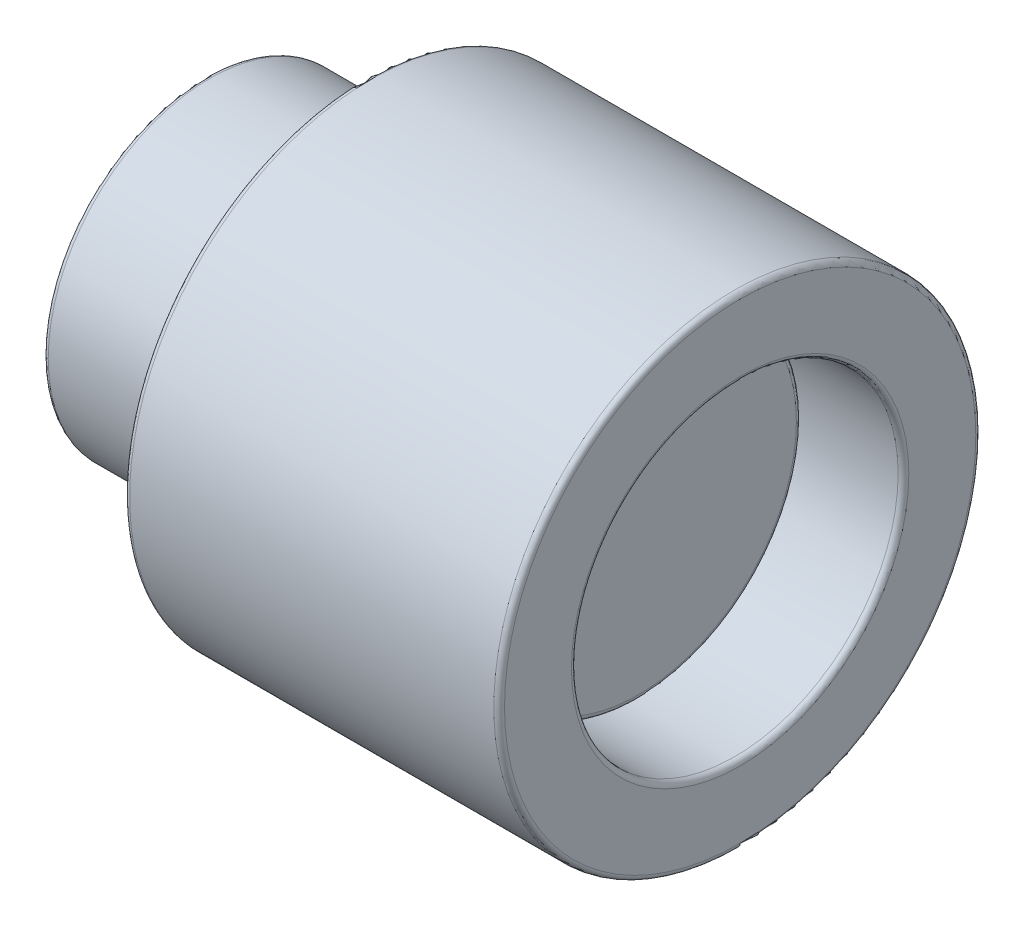
ISO-10303-21;
HEADER;
FILE_DESCRIPTION(('STEP AP214'),'2;1');
FILE_NAME('part.step','',(''),(''),'','','');
FILE_SCHEMA(('AUTOMOTIVE_DESIGN { 1 0 10303 214 1 1 1 1 }'));
ENDSEC;
DATA;
#1=APPLICATION_CONTEXT('core data for automotive mechanical design processes');
#2=APPLICATION_PROTOCOL_DEFINITION('international standard','automotive_design',2000,#1);
#3=PRODUCT_CONTEXT('',#1,'mechanical');
#4=PRODUCT('Part','Part','',(#3));
#5=PRODUCT_RELATED_PRODUCT_CATEGORY('part','',(#4));
#6=PRODUCT_DEFINITION_FORMATION('','',#4);
#7=PRODUCT_DEFINITION_CONTEXT('part definition',#1,'design');
#8=PRODUCT_DEFINITION('design','',#6,#7);
#9=PRODUCT_DEFINITION_SHAPE('','',#8);
#10=(LENGTH_UNIT() NAMED_UNIT(*) SI_UNIT(.MILLI.,.METRE.));
#11=(NAMED_UNIT(*) PLANE_ANGLE_UNIT() SI_UNIT($,.RADIAN.));
#12=(NAMED_UNIT(*) SI_UNIT($,.STERADIAN.) SOLID_ANGLE_UNIT());
#13=UNCERTAINTY_MEASURE_WITH_UNIT(LENGTH_MEASURE(1.E-05),#10,'distance_accuracy_value','');
#14=(GEOMETRIC_REPRESENTATION_CONTEXT(3) GLOBAL_UNCERTAINTY_ASSIGNED_CONTEXT((#13)) GLOBAL_UNIT_ASSIGNED_CONTEXT((#10,
#11,#12)) REPRESENTATION_CONTEXT('',''));
#15=CARTESIAN_POINT('',(0.,0.,0.));
#16=DIRECTION('',(0.,0.,1.));
#17=DIRECTION('',(1.,0.,0.));
#18=AXIS2_PLACEMENT_3D('',#15,#16,#17);
#19=CARTESIAN_POINT('',(5.1,0.,0.));
#20=DIRECTION('',(1.,0.,0.));
#21=DIRECTION('',(0.,0.,-1.));
#22=AXIS2_PLACEMENT_3D('',#19,#20,#21);
#23=PLANE('',#22);
#24=CARTESIAN_POINT('',(5.1,0.,0.));
#25=DIRECTION('',(1.,0.,0.));
#26=DIRECTION('',(0.,0.,-1.));
#27=AXIS2_PLACEMENT_3D('',#24,#25,#26);
#28=CIRCLE('',#27,2.95);
#29=CARTESIAN_POINT('',(5.1,0.,-2.95));
#30=VERTEX_POINT('',#29);
#31=EDGE_CURVE('E11',#30,#30,#28,.T.);
#32=ORIENTED_EDGE('',*,*,#31,.T.);
#33=EDGE_LOOP('',(#32));
#34=FACE_BOUND('',#33,.T.);
#35=ADVANCED_FACE('F48',(#34),#23,.T.);
#36=CARTESIAN_POINT('',(15.6267027304759,0.,0.));
#37=DIRECTION('',(-1.,0.,0.));
#38=DIRECTION('',(0.,0.,1.));
#39=AXIS2_PLACEMENT_3D('',#36,#37,#38);
#40=CYLINDRICAL_SURFACE('',#39,3.05);
#41=CARTESIAN_POINT('',(5.,0.,0.));
#42=DIRECTION('',(1.,0.,0.));
#43=DIRECTION('',(0.,0.,-1.));
#44=AXIS2_PLACEMENT_3D('',#41,#42,#43);
#45=CIRCLE('',#44,3.05);
#46=CARTESIAN_POINT('',(5.,0.,-3.05));
#47=VERTEX_POINT('',#46);
#48=EDGE_CURVE('E55',#47,#47,#45,.F.);
#49=ORIENTED_EDGE('',*,*,#48,.T.);
#50=EDGE_LOOP('',(#49));
#51=FACE_BOUND('',#50,.T.);
#52=CARTESIAN_POINT('',(0.,0.,0.));
#53=DIRECTION('',(1.,0.,0.));
#54=DIRECTION('',(0.,0.,-1.));
#55=AXIS2_PLACEMENT_3D('',#52,#53,#54);
#56=CIRCLE('',#55,3.05);
#57=CARTESIAN_POINT('',(0.,0.,-3.05));
#58=VERTEX_POINT('',#57);
#59=EDGE_CURVE('E71',#58,#58,#56,.F.);
#60=ORIENTED_EDGE('',*,*,#59,.F.);
#61=EDGE_LOOP('',(#60));
#62=FACE_BOUND('',#61,.T.);
#63=ADVANCED_FACE('F78',(#51,#62),#40,.T.);
#64=CARTESIAN_POINT('',(8.62670273047588,0.,0.));
#65=DIRECTION('',(-1.,0.,0.));
#66=DIRECTION('',(0.,0.,1.));
#67=AXIS2_PLACEMENT_3D('',#64,#65,#66);
#68=CYLINDRICAL_SURFACE('',#67,3.02);
#69=CARTESIAN_POINT('',(-0.0714142842854291,0.,0.));
#70=DIRECTION('',(1.,0.,0.));
#71=DIRECTION('',(0.,0.,-1.));
#72=AXIS2_PLACEMENT_3D('',#69,#70,#71);
#73=CIRCLE('',#72,3.02);
#74=CARTESIAN_POINT('',(-0.0714142842854291,0.,-3.02));
#75=VERTEX_POINT('',#74);
#76=EDGE_CURVE('E59',#75,#75,#73,.F.);
#77=ORIENTED_EDGE('',*,*,#76,.T.);
#78=EDGE_LOOP('',(#77));
#79=FACE_BOUND('',#78,.T.);
#80=CARTESIAN_POINT('',(-2.9,0.,0.));
#81=DIRECTION('',(-1.,0.,0.));
#82=DIRECTION('',(0.,0.,1.));
#83=AXIS2_PLACEMENT_3D('',#80,#81,#82);
#84=CIRCLE('',#83,3.02);
#85=CARTESIAN_POINT('',(-2.9,0.,3.02));
#86=VERTEX_POINT('',#85);
#87=EDGE_CURVE('E63',#86,#86,#84,.F.);
#88=ORIENTED_EDGE('',*,*,#87,.T.);
#89=EDGE_LOOP('',(#88));
#90=FACE_BOUND('',#89,.T.);
#91=ADVANCED_FACE('F80',(#79,#90),#68,.T.);
#92=CARTESIAN_POINT('',(-3.,0.,0.));
#93=DIRECTION('',(-1.,0.,0.));
#94=DIRECTION('',(0.,0.,1.));
#95=AXIS2_PLACEMENT_3D('',#92,#93,#94);
#96=PLANE('',#95);
#97=CARTESIAN_POINT('',(-3.,0.,0.));
#98=DIRECTION('',(-1.,0.,0.));
#99=DIRECTION('',(0.,0.,1.));
#100=AXIS2_PLACEMENT_3D('',#97,#98,#99);
#101=CIRCLE('',#100,2.92);
#102=CARTESIAN_POINT('',(-3.,0.,2.92));
#103=VERTEX_POINT('',#102);
#104=EDGE_CURVE('E68',#103,#103,#101,.T.);
#105=ORIENTED_EDGE('',*,*,#104,.T.);
#106=EDGE_LOOP('',(#105));
#107=FACE_BOUND('',#106,.T.);
#108=ADVANCED_FACE('F86',(#107),#96,.T.);
#109=CARTESIAN_POINT('',(-2.9,0.,0.));
#110=DIRECTION('',(-1.,0.,0.));
#111=DIRECTION('',(0.,0.,1.));
#112=AXIS2_PLACEMENT_3D('',#109,#110,#111);
#113=TOROIDAL_SURFACE('',#112,2.92,0.1);
#114=ORIENTED_EDGE('',*,*,#87,.F.);
#115=EDGE_LOOP('',(#114));
#116=FACE_BOUND('',#115,.T.);
#117=ORIENTED_EDGE('',*,*,#104,.F.);
#118=EDGE_LOOP('',(#117));
#119=FACE_BOUND('',#118,.T.);
#120=ADVANCED_FACE('F92',(#116,#119),#113,.T.);
#121=CARTESIAN_POINT('',(-0.0714142842854287,0.,0.));
#122=DIRECTION('',(1.,0.,0.));
#123=DIRECTION('',(0.,0.,-1.));
#124=AXIS2_PLACEMENT_3D('',#121,#122,#123);
#125=TOROIDAL_SURFACE('',#124,3.12,0.1);
#126=ORIENTED_EDGE('',*,*,#59,.T.);
#127=EDGE_LOOP('',(#126));
#128=FACE_BOUND('',#127,.T.);
#129=ORIENTED_EDGE('',*,*,#76,.F.);
#130=EDGE_LOOP('',(#129));
#131=FACE_BOUND('',#130,.T.);
#132=ADVANCED_FACE('F75',(#128,#131),#125,.F.);
#133=CARTESIAN_POINT('',(5.,0.,0.));
#134=DIRECTION('',(1.,0.,0.));
#135=DIRECTION('',(0.,0.,-1.));
#136=AXIS2_PLACEMENT_3D('',#133,#134,#135);
#137=TOROIDAL_SURFACE('',#136,2.95,0.1);
#138=ORIENTED_EDGE('',*,*,#31,.F.);
#139=EDGE_LOOP('',(#138));
#140=FACE_BOUND('',#139,.T.);
#141=ORIENTED_EDGE('',*,*,#48,.F.);
#142=EDGE_LOOP('',(#141));
#143=FACE_BOUND('',#142,.T.);
#144=ADVANCED_FACE('F50',(#140,#143),#137,.T.);
#145=CLOSED_SHELL('',(#35,#63,#91,#108,#120,#132,#144));
#146=MANIFOLD_SOLID_BREP('B2',#145);
#147=CARTESIAN_POINT('',(7.,0.,0.));
#148=DIRECTION('',(1.,0.,0.));
#149=DIRECTION('',(0.,0.,-1.));
#150=AXIS2_PLACEMENT_3D('',#147,#148,#149);
#151=PLANE('',#150);
#152=CARTESIAN_POINT('',(7.,0.,0.));
#153=DIRECTION('',(1.,0.,0.));
#154=DIRECTION('',(0.,0.,-1.));
#155=AXIS2_PLACEMENT_3D('',#152,#153,#154);
#156=CIRCLE('',#155,3.15);
#157=CARTESIAN_POINT('',(7.,0.,-3.15));
#158=VERTEX_POINT('',#157);
#159=EDGE_CURVE('E179',#158,#158,#156,.F.);
#160=ORIENTED_EDGE('',*,*,#159,.T.);
#161=EDGE_LOOP('',(#160));
#162=FACE_BOUND('',#161,.T.);
#163=CARTESIAN_POINT('',(7.,0.,0.));
#164=DIRECTION('',(1.,0.,0.));
#165=DIRECTION('',(0.,0.,-1.));
#166=AXIS2_PLACEMENT_3D('',#163,#164,#165);
#167=CIRCLE('',#166,4.4);
#168=CARTESIAN_POINT('',(7.,0.,-4.4));
#169=VERTEX_POINT('',#168);
#170=EDGE_CURVE('E184',#169,#169,#167,.T.);
#171=ORIENTED_EDGE('',*,*,#170,.T.);
#172=EDGE_LOOP('',(#171));
#173=FACE_BOUND('',#172,.T.);
#174=ADVANCED_FACE('F164',(#162,#173),#151,.T.);
#175=CARTESIAN_POINT('',(0.,0.,0.));
#176=DIRECTION('',(1.,0.,0.));
#177=DIRECTION('',(0.,0.,-1.));
#178=AXIS2_PLACEMENT_3D('',#175,#176,#177);
#179=PLANE('',#178);
#180=CARTESIAN_POINT('',(0.,0.,0.));
#181=DIRECTION('',(1.,0.,0.));
#182=DIRECTION('',(0.,0.,-1.));
#183=AXIS2_PLACEMENT_3D('',#180,#181,#182);
#184=CIRCLE('',#183,4.4);
#185=CARTESIAN_POINT('',(0.,0.,-4.4));
#186=VERTEX_POINT('',#185);
#187=EDGE_CURVE('E47',#186,#186,#184,.F.);
#188=ORIENTED_EDGE('',*,*,#187,.T.);
#189=EDGE_LOOP('',(#188));
#190=FACE_BOUND('',#189,.T.);
#191=CARTESIAN_POINT('',(0.,0.,0.));
#192=DIRECTION('',(1.,0.,0.));
#193=DIRECTION('',(0.,0.,-1.));
#194=AXIS2_PLACEMENT_3D('',#191,#192,#193);
#195=CIRCLE('',#194,3.05);
#196=CARTESIAN_POINT('',(0.,0.,-3.05));
#197=VERTEX_POINT('',#196);
#198=EDGE_CURVE('E190',#197,#197,#195,.T.);
#199=ORIENTED_EDGE('',*,*,#198,.T.);
#200=EDGE_LOOP('',(#199));
#201=FACE_BOUND('',#200,.T.);
#202=ADVANCED_FACE('F194',(#190,#201),#179,.F.);
#203=CARTESIAN_POINT('',(7.,0.,0.));
#204=DIRECTION('',(-1.,0.,0.));
#205=DIRECTION('',(0.,0.,1.));
#206=AXIS2_PLACEMENT_3D('',#203,#204,#205);
#207=CYLINDRICAL_SURFACE('',#206,4.5);
#208=CARTESIAN_POINT('',(0.1,0.,0.));
#209=DIRECTION('',(1.,0.,0.));
#210=DIRECTION('',(0.,0.,-1.));
#211=AXIS2_PLACEMENT_3D('',#208,#209,#210);
#212=CIRCLE('',#211,4.5);
#213=CARTESIAN_POINT('',(0.1,0.,-4.5));
#214=VERTEX_POINT('',#213);
#215=EDGE_CURVE('E171',#214,#214,#212,.T.);
#216=ORIENTED_EDGE('',*,*,#215,.T.);
#217=EDGE_LOOP('',(#216));
#218=FACE_BOUND('',#217,.T.);
#219=CARTESIAN_POINT('',(6.9,0.,0.));
#220=DIRECTION('',(1.,0.,0.));
#221=DIRECTION('',(0.,0.,-1.));
#222=AXIS2_PLACEMENT_3D('',#219,#220,#221);
#223=CIRCLE('',#222,4.5);
#224=CARTESIAN_POINT('',(6.9,0.,-4.5));
#225=VERTEX_POINT('',#224);
#226=EDGE_CURVE('E175',#225,#225,#223,.F.);
#227=ORIENTED_EDGE('',*,*,#226,.T.);
#228=EDGE_LOOP('',(#227));
#229=FACE_BOUND('',#228,.T.);
#230=ADVANCED_FACE('F199',(#218,#229),#207,.T.);
#231=CARTESIAN_POINT('',(7.,0.,0.));
#232=DIRECTION('',(-1.,0.,0.));
#233=DIRECTION('',(0.,0.,1.));
#234=AXIS2_PLACEMENT_3D('',#231,#232,#233);
#235=CYLINDRICAL_SURFACE('',#234,3.05);
#236=CARTESIAN_POINT('',(6.9,0.,0.));
#237=DIRECTION('',(1.,0.,0.));
#238=DIRECTION('',(0.,0.,-1.));
#239=AXIS2_PLACEMENT_3D('',#236,#237,#238);
#240=CIRCLE('',#239,3.05);
#241=CARTESIAN_POINT('',(6.9,0.,-3.05));
#242=VERTEX_POINT('',#241);
#243=EDGE_CURVE('E187',#242,#242,#240,.T.);
#244=ORIENTED_EDGE('',*,*,#243,.T.);
#245=EDGE_LOOP('',(#244));
#246=FACE_BOUND('',#245,.T.);
#247=ORIENTED_EDGE('',*,*,#198,.F.);
#248=EDGE_LOOP('',(#247));
#249=FACE_BOUND('',#248,.T.);
#250=ADVANCED_FACE('F196',(#246,#249),#235,.F.);
#251=CARTESIAN_POINT('',(6.9,0.,0.));
#252=DIRECTION('',(1.,0.,0.));
#253=DIRECTION('',(0.,0.,-1.));
#254=AXIS2_PLACEMENT_3D('',#251,#252,#253);
#255=TOROIDAL_SURFACE('',#254,3.15,0.1);
#256=ORIENTED_EDGE('',*,*,#159,.F.);
#257=EDGE_LOOP('',(#256));
#258=FACE_BOUND('',#257,.T.);
#259=ORIENTED_EDGE('',*,*,#243,.F.);
#260=EDGE_LOOP('',(#259));
#261=FACE_BOUND('',#260,.T.);
#262=ADVANCED_FACE('F198',(#258,#261),#255,.T.);
#263=CARTESIAN_POINT('',(0.1,0.,0.));
#264=DIRECTION('',(1.,0.,0.));
#265=DIRECTION('',(0.,0.,-1.));
#266=AXIS2_PLACEMENT_3D('',#263,#264,#265);
#267=TOROIDAL_SURFACE('',#266,4.4,0.1);
#268=ORIENTED_EDGE('',*,*,#187,.F.);
#269=EDGE_LOOP('',(#268));
#270=FACE_BOUND('',#269,.T.);
#271=ORIENTED_EDGE('',*,*,#215,.F.);
#272=EDGE_LOOP('',(#271));
#273=FACE_BOUND('',#272,.T.);
#274=ADVANCED_FACE('F206',(#270,#273),#267,.T.);
#275=CARTESIAN_POINT('',(6.9,0.,0.));
#276=DIRECTION('',(1.,0.,0.));
#277=DIRECTION('',(0.,0.,-1.));
#278=AXIS2_PLACEMENT_3D('',#275,#276,#277);
#279=TOROIDAL_SURFACE('',#278,4.4,0.1);
#280=ORIENTED_EDGE('',*,*,#226,.F.);
#281=EDGE_LOOP('',(#280));
#282=FACE_BOUND('',#281,.T.);
#283=ORIENTED_EDGE('',*,*,#170,.F.);
#284=EDGE_LOOP('',(#283));
#285=FACE_BOUND('',#284,.T.);
#286=ADVANCED_FACE('F166',(#282,#285),#279,.T.);
#287=CLOSED_SHELL('',(#174,#202,#230,#250,#262,#274,#286));
#288=MANIFOLD_SOLID_BREP('B6',#287);
#289=ADVANCED_BREP_SHAPE_REPRESENTATION('',(#18,#146,#288),#14);
#290=SHAPE_DEFINITION_REPRESENTATION(#9,#289);
ENDSEC;
END-ISO-10303-21;
